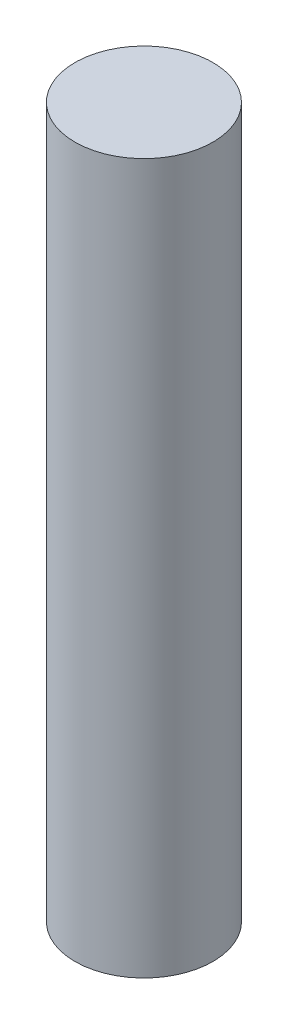
ISO-10303-21;
HEADER;
FILE_DESCRIPTION(('STEP AP214'),'2;1');
FILE_NAME('part.step','',(''),(''),'','','');
FILE_SCHEMA(('AUTOMOTIVE_DESIGN { 1 0 10303 214 1 1 1 1 }'));
ENDSEC;
DATA;
#1=APPLICATION_CONTEXT('core data for automotive mechanical design processes');
#2=APPLICATION_PROTOCOL_DEFINITION('international standard','automotive_design',2000,#1);
#3=PRODUCT_CONTEXT('',#1,'mechanical');
#4=PRODUCT('Part','Part','',(#3));
#5=PRODUCT_RELATED_PRODUCT_CATEGORY('part','',(#4));
#6=PRODUCT_DEFINITION_FORMATION('','',#4);
#7=PRODUCT_DEFINITION_CONTEXT('part definition',#1,'design');
#8=PRODUCT_DEFINITION('design','',#6,#7);
#9=PRODUCT_DEFINITION_SHAPE('','',#8);
#10=(LENGTH_UNIT() NAMED_UNIT(*) SI_UNIT(.MILLI.,.METRE.));
#11=(NAMED_UNIT(*) PLANE_ANGLE_UNIT() SI_UNIT($,.RADIAN.));
#12=(NAMED_UNIT(*) SI_UNIT($,.STERADIAN.) SOLID_ANGLE_UNIT());
#13=UNCERTAINTY_MEASURE_WITH_UNIT(LENGTH_MEASURE(1.E-05),#10,'distance_accuracy_value','');
#14=(GEOMETRIC_REPRESENTATION_CONTEXT(3) GLOBAL_UNCERTAINTY_ASSIGNED_CONTEXT((#13)) GLOBAL_UNIT_ASSIGNED_CONTEXT((#10,
#11,#12)) REPRESENTATION_CONTEXT('',''));
#15=CARTESIAN_POINT('',(0.,0.,0.));
#16=DIRECTION('',(0.,0.,1.));
#17=DIRECTION('',(1.,0.,0.));
#18=AXIS2_PLACEMENT_3D('',#15,#16,#17);
#19=CARTESIAN_POINT('',(0.,28.575,0.));
#20=DIRECTION('',(0.,-1.,0.));
#21=DIRECTION('',(0.,0.,-1.));
#22=AXIS2_PLACEMENT_3D('',#19,#20,#21);
#23=CYLINDRICAL_SURFACE('',#22,2.778125);
#24=CARTESIAN_POINT('',(0.,28.575,0.));
#25=DIRECTION('',(0.,1.,0.));
#26=DIRECTION('',(0.,0.,1.));
#27=AXIS2_PLACEMENT_3D('',#24,#25,#26);
#28=CIRCLE('',#27,2.778125);
#29=CARTESIAN_POINT('',(0.,28.575,2.778125));
#30=VERTEX_POINT('',#29);
#31=EDGE_CURVE('E10',#30,#30,#28,.T.);
#32=ORIENTED_EDGE('',*,*,#31,.F.);
#33=EDGE_LOOP('',(#32));
#34=FACE_BOUND('',#33,.T.);
#35=CARTESIAN_POINT('',(0.,0.,0.));
#36=DIRECTION('',(0.,1.,0.));
#37=DIRECTION('',(0.,0.,1.));
#38=AXIS2_PLACEMENT_3D('',#35,#36,#37);
#39=CIRCLE('',#38,2.778125);
#40=CARTESIAN_POINT('',(0.,0.,2.778125));
#41=VERTEX_POINT('',#40);
#42=EDGE_CURVE('E34',#41,#41,#39,.T.);
#43=ORIENTED_EDGE('',*,*,#42,.T.);
#44=EDGE_LOOP('',(#43));
#45=FACE_BOUND('',#44,.T.);
#46=ADVANCED_FACE('F31',(#34,#45),#23,.T.);
#47=CARTESIAN_POINT('',(0.,28.575,0.));
#48=DIRECTION('',(0.,1.,0.));
#49=DIRECTION('',(0.,0.,1.));
#50=AXIS2_PLACEMENT_3D('',#47,#48,#49);
#51=PLANE('',#50);
#52=ORIENTED_EDGE('',*,*,#31,.T.);
#53=EDGE_LOOP('',(#52));
#54=FACE_BOUND('',#53,.T.);
#55=ADVANCED_FACE('F46',(#54),#51,.T.);
#56=CARTESIAN_POINT('',(0.,0.,0.));
#57=DIRECTION('',(0.,1.,0.));
#58=DIRECTION('',(0.,0.,1.));
#59=AXIS2_PLACEMENT_3D('',#56,#57,#58);
#60=PLANE('',#59);
#61=ORIENTED_EDGE('',*,*,#42,.F.);
#62=EDGE_LOOP('',(#61));
#63=FACE_BOUND('',#62,.T.);
#64=ADVANCED_FACE('F44',(#63),#60,.F.);
#65=CLOSED_SHELL('',(#46,#55,#64));
#66=MANIFOLD_SOLID_BREP('B2',#65);
#67=ADVANCED_BREP_SHAPE_REPRESENTATION('',(#18,#66),#14);
#68=SHAPE_DEFINITION_REPRESENTATION(#9,#67);
ENDSEC;
END-ISO-10303-21;
